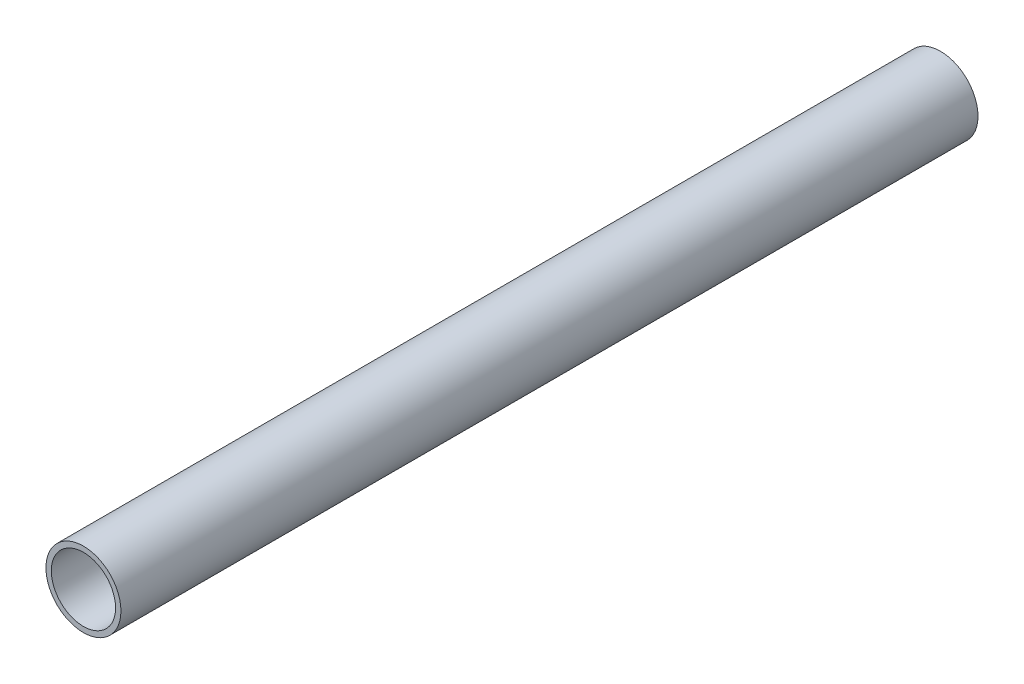
ISO-10303-21;
HEADER;
FILE_DESCRIPTION(('STEP AP214'),'2;1');
FILE_NAME('part.step','',(''),(''),'','','');
FILE_SCHEMA(('AUTOMOTIVE_DESIGN { 1 0 10303 214 1 1 1 1 }'));
ENDSEC;
DATA;
#1=APPLICATION_CONTEXT('core data for automotive mechanical design processes');
#2=APPLICATION_PROTOCOL_DEFINITION('international standard','automotive_design',2000,#1);
#3=PRODUCT_CONTEXT('',#1,'mechanical');
#4=PRODUCT('Part','Part','',(#3));
#5=PRODUCT_RELATED_PRODUCT_CATEGORY('part','',(#4));
#6=PRODUCT_DEFINITION_FORMATION('','',#4);
#7=PRODUCT_DEFINITION_CONTEXT('part definition',#1,'design');
#8=PRODUCT_DEFINITION('design','',#6,#7);
#9=PRODUCT_DEFINITION_SHAPE('','',#8);
#10=(LENGTH_UNIT() NAMED_UNIT(*) SI_UNIT(.MILLI.,.METRE.));
#11=(NAMED_UNIT(*) PLANE_ANGLE_UNIT() SI_UNIT($,.RADIAN.));
#12=(NAMED_UNIT(*) SI_UNIT($,.STERADIAN.) SOLID_ANGLE_UNIT());
#13=UNCERTAINTY_MEASURE_WITH_UNIT(LENGTH_MEASURE(1.E-05),#10,'distance_accuracy_value','');
#14=(GEOMETRIC_REPRESENTATION_CONTEXT(3) GLOBAL_UNCERTAINTY_ASSIGNED_CONTEXT((#13)) GLOBAL_UNIT_ASSIGNED_CONTEXT((#10,
#11,#12)) REPRESENTATION_CONTEXT('',''));
#15=CARTESIAN_POINT('',(0.,0.,0.));
#16=DIRECTION('',(0.,0.,1.));
#17=DIRECTION('',(1.,0.,0.));
#18=AXIS2_PLACEMENT_3D('',#15,#16,#17);
#19=CARTESIAN_POINT('',(0.,0.,127.));
#20=DIRECTION('',(0.,0.,1.));
#21=DIRECTION('',(1.,0.,0.));
#22=AXIS2_PLACEMENT_3D('',#19,#20,#21);
#23=PLANE('',#22);
#24=CARTESIAN_POINT('',(0.,0.,127.));
#25=DIRECTION('',(0.,0.,1.));
#26=DIRECTION('',(1.,0.,0.));
#27=AXIS2_PLACEMENT_3D('',#24,#25,#26);
#28=CIRCLE('',#27,11.1125);
#29=CARTESIAN_POINT('',(11.1125,0.,127.));
#30=VERTEX_POINT('',#29);
#31=EDGE_CURVE('E10',#30,#30,#28,.T.);
#32=ORIENTED_EDGE('',*,*,#31,.T.);
#33=EDGE_LOOP('',(#32));
#34=FACE_BOUND('',#33,.T.);
#35=CARTESIAN_POINT('',(0.,0.,127.));
#36=DIRECTION('',(0.,0.,1.));
#37=DIRECTION('',(1.,0.,0.));
#38=AXIS2_PLACEMENT_3D('',#35,#36,#37);
#39=CIRCLE('',#38,9.525);
#40=CARTESIAN_POINT('',(9.525,0.,127.));
#41=VERTEX_POINT('',#40);
#42=EDGE_CURVE('E43',#41,#41,#39,.T.);
#43=ORIENTED_EDGE('',*,*,#42,.F.);
#44=EDGE_LOOP('',(#43));
#45=FACE_BOUND('',#44,.T.);
#46=ADVANCED_FACE('F32',(#34,#45),#23,.T.);
#47=CARTESIAN_POINT('',(0.,0.,-127.));
#48=DIRECTION('',(0.,0.,1.));
#49=DIRECTION('',(1.,0.,0.));
#50=AXIS2_PLACEMENT_3D('',#47,#48,#49);
#51=PLANE('',#50);
#52=CARTESIAN_POINT('',(0.,0.,-127.));
#53=DIRECTION('',(0.,0.,1.));
#54=DIRECTION('',(1.,0.,0.));
#55=AXIS2_PLACEMENT_3D('',#52,#53,#54);
#56=CIRCLE('',#55,11.1125);
#57=CARTESIAN_POINT('',(11.1125,0.,-127.));
#58=VERTEX_POINT('',#57);
#59=EDGE_CURVE('E36',#58,#58,#56,.T.);
#60=ORIENTED_EDGE('',*,*,#59,.F.);
#61=EDGE_LOOP('',(#60));
#62=FACE_BOUND('',#61,.T.);
#63=CARTESIAN_POINT('',(0.,0.,-127.));
#64=DIRECTION('',(0.,0.,1.));
#65=DIRECTION('',(1.,0.,0.));
#66=AXIS2_PLACEMENT_3D('',#63,#64,#65);
#67=CIRCLE('',#66,9.525);
#68=CARTESIAN_POINT('',(9.525,0.,-127.));
#69=VERTEX_POINT('',#68);
#70=EDGE_CURVE('E45',#69,#69,#67,.T.);
#71=ORIENTED_EDGE('',*,*,#70,.T.);
#72=EDGE_LOOP('',(#71));
#73=FACE_BOUND('',#72,.T.);
#74=ADVANCED_FACE('F55',(#62,#73),#51,.F.);
#75=CARTESIAN_POINT('',(0.,0.,127.));
#76=DIRECTION('',(0.,0.,-1.));
#77=DIRECTION('',(-1.,0.,0.));
#78=AXIS2_PLACEMENT_3D('',#75,#76,#77);
#79=CYLINDRICAL_SURFACE('',#78,11.1125);
#80=ORIENTED_EDGE('',*,*,#31,.F.);
#81=EDGE_LOOP('',(#80));
#82=FACE_BOUND('',#81,.T.);
#83=ORIENTED_EDGE('',*,*,#59,.T.);
#84=EDGE_LOOP('',(#83));
#85=FACE_BOUND('',#84,.T.);
#86=ADVANCED_FACE('F34',(#82,#85),#79,.T.);
#87=CARTESIAN_POINT('',(0.,0.,127.));
#88=DIRECTION('',(0.,0.,-1.));
#89=DIRECTION('',(-1.,0.,0.));
#90=AXIS2_PLACEMENT_3D('',#87,#88,#89);
#91=CYLINDRICAL_SURFACE('',#90,9.525);
#92=ORIENTED_EDGE('',*,*,#42,.T.);
#93=EDGE_LOOP('',(#92));
#94=FACE_BOUND('',#93,.T.);
#95=ORIENTED_EDGE('',*,*,#70,.F.);
#96=EDGE_LOOP('',(#95));
#97=FACE_BOUND('',#96,.T.);
#98=ADVANCED_FACE('F51',(#94,#97),#91,.F.);
#99=CLOSED_SHELL('',(#46,#74,#86,#98));
#100=MANIFOLD_SOLID_BREP('B2',#99);
#101=ADVANCED_BREP_SHAPE_REPRESENTATION('',(#18,#100),#14);
#102=SHAPE_DEFINITION_REPRESENTATION(#9,#101);
ENDSEC;
END-ISO-10303-21;
